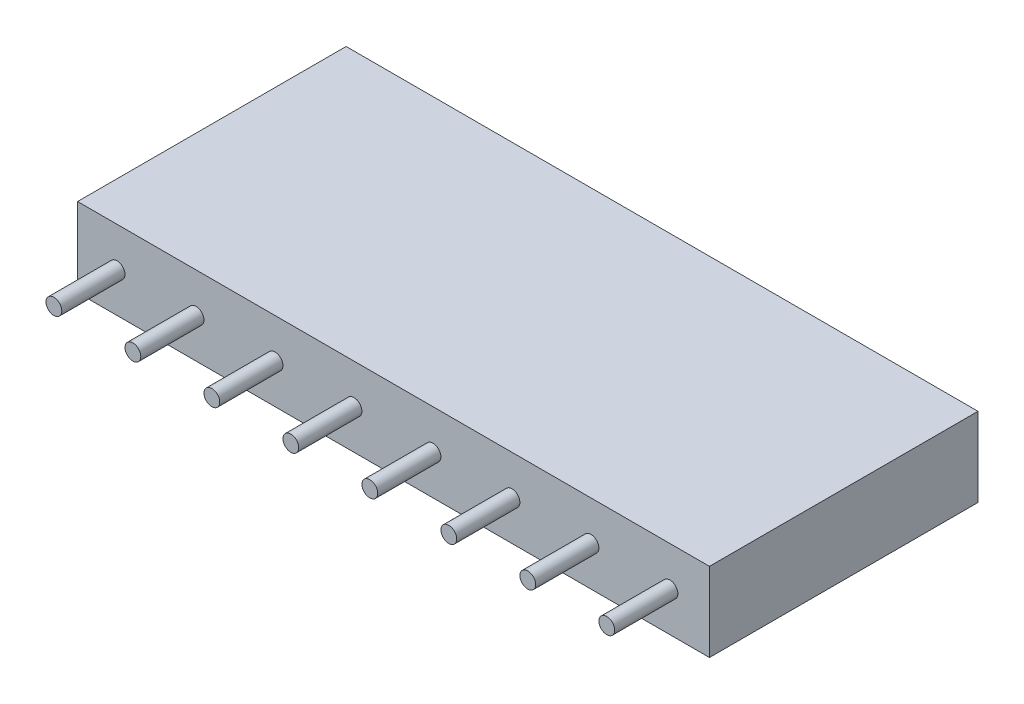
ISO-10303-21;
HEADER;
FILE_DESCRIPTION(('STEP AP214'),'2;1');
FILE_NAME('part.step','',(''),(''),'','','');
FILE_SCHEMA(('AUTOMOTIVE_DESIGN { 1 0 10303 214 1 1 1 1 }'));
ENDSEC;
DATA;
#1=APPLICATION_CONTEXT('core data for automotive mechanical design processes');
#2=APPLICATION_PROTOCOL_DEFINITION('international standard','automotive_design',2000,#1);
#3=PRODUCT_CONTEXT('',#1,'mechanical');
#4=PRODUCT('Part','Part','',(#3));
#5=PRODUCT_RELATED_PRODUCT_CATEGORY('part','',(#4));
#6=PRODUCT_DEFINITION_FORMATION('','',#4);
#7=PRODUCT_DEFINITION_CONTEXT('part definition',#1,'design');
#8=PRODUCT_DEFINITION('design','',#6,#7);
#9=PRODUCT_DEFINITION_SHAPE('','',#8);
#10=(LENGTH_UNIT() NAMED_UNIT(*) SI_UNIT(.MILLI.,.METRE.));
#11=(NAMED_UNIT(*) PLANE_ANGLE_UNIT() SI_UNIT($,.RADIAN.));
#12=(NAMED_UNIT(*) SI_UNIT($,.STERADIAN.) SOLID_ANGLE_UNIT());
#13=UNCERTAINTY_MEASURE_WITH_UNIT(LENGTH_MEASURE(1.E-05),#10,'distance_accuracy_value','');
#14=(GEOMETRIC_REPRESENTATION_CONTEXT(3) GLOBAL_UNCERTAINTY_ASSIGNED_CONTEXT((#13)) GLOBAL_UNIT_ASSIGNED_CONTEXT((#10,
#11,#12)) REPRESENTATION_CONTEXT('',''));
#15=CARTESIAN_POINT('',(0.,0.,0.));
#16=DIRECTION('',(0.,0.,1.));
#17=DIRECTION('',(1.,0.,0.));
#18=AXIS2_PLACEMENT_3D('',#15,#16,#17);
#19=CARTESIAN_POINT('',(-18.75,1.25,10.5));
#20=DIRECTION('',(0.,0.,1.));
#21=DIRECTION('',(1.,0.,0.));
#22=AXIS2_PLACEMENT_3D('',#19,#20,#21);
#23=PLANE('',#22);
#24=CARTESIAN_POINT('',(-18.75,1.25,10.5));
#25=DIRECTION('',(0.,0.,1.));
#26=DIRECTION('',(1.,0.,0.));
#27=AXIS2_PLACEMENT_3D('',#24,#25,#26);
#28=CIRCLE('',#27,0.25);
#29=CARTESIAN_POINT('',(-18.5,1.25,10.5));
#30=VERTEX_POINT('',#29);
#31=EDGE_CURVE('E11',#30,#30,#28,.T.);
#32=ORIENTED_EDGE('',*,*,#31,.T.);
#33=EDGE_LOOP('',(#32));
#34=FACE_BOUND('',#33,.T.);
#35=ADVANCED_FACE('F33',(#34),#23,.T.);
#36=CARTESIAN_POINT('',(-18.75,1.25,10.5));
#37=DIRECTION('',(0.,0.,-1.));
#38=DIRECTION('',(-1.,0.,0.));
#39=AXIS2_PLACEMENT_3D('',#36,#37,#38);
#40=CYLINDRICAL_SURFACE('',#39,0.25);
#41=ORIENTED_EDGE('',*,*,#31,.F.);
#42=EDGE_LOOP('',(#41));
#43=FACE_BOUND('',#42,.T.);
#44=CARTESIAN_POINT('',(-18.75,1.25,8.5));
#45=DIRECTION('',(0.,0.,1.));
#46=DIRECTION('',(1.,0.,0.));
#47=AXIS2_PLACEMENT_3D('',#44,#45,#46);
#48=CIRCLE('',#47,0.25);
#49=CARTESIAN_POINT('',(-18.5,1.25,8.5));
#50=VERTEX_POINT('',#49);
#51=EDGE_CURVE('E41',#50,#50,#48,.T.);
#52=ORIENTED_EDGE('',*,*,#51,.T.);
#53=EDGE_LOOP('',(#52));
#54=FACE_BOUND('',#53,.T.);
#55=ADVANCED_FACE('F153',(#43,#54),#40,.T.);
#56=CARTESIAN_POINT('',(-16.25,1.25,10.5));
#57=DIRECTION('',(0.,0.,1.));
#58=DIRECTION('',(1.,0.,0.));
#59=AXIS2_PLACEMENT_3D('',#56,#57,#58);
#60=PLANE('',#59);
#61=CARTESIAN_POINT('',(-16.25,1.25,10.5));
#62=DIRECTION('',(0.,0.,1.));
#63=DIRECTION('',(1.,0.,0.));
#64=AXIS2_PLACEMENT_3D('',#61,#62,#63);
#65=CIRCLE('',#64,0.25);
#66=CARTESIAN_POINT('',(-16.,1.25,10.5));
#67=VERTEX_POINT('',#66);
#68=EDGE_CURVE('E148',#67,#67,#65,.T.);
#69=ORIENTED_EDGE('',*,*,#68,.T.);
#70=EDGE_LOOP('',(#69));
#71=FACE_BOUND('',#70,.T.);
#72=ADVANCED_FACE('F176',(#71),#60,.T.);
#73=CARTESIAN_POINT('',(-16.25,1.25,10.5));
#74=DIRECTION('',(0.,0.,-1.));
#75=DIRECTION('',(-1.,0.,0.));
#76=AXIS2_PLACEMENT_3D('',#73,#74,#75);
#77=CYLINDRICAL_SURFACE('',#76,0.25);
#78=ORIENTED_EDGE('',*,*,#68,.F.);
#79=EDGE_LOOP('',(#78));
#80=FACE_BOUND('',#79,.T.);
#81=CARTESIAN_POINT('',(-16.25,1.25,8.5));
#82=DIRECTION('',(0.,0.,1.));
#83=DIRECTION('',(1.,0.,0.));
#84=AXIS2_PLACEMENT_3D('',#81,#82,#83);
#85=CIRCLE('',#84,0.25);
#86=CARTESIAN_POINT('',(-16.,1.25,8.5));
#87=VERTEX_POINT('',#86);
#88=EDGE_CURVE('E145',#87,#87,#85,.T.);
#89=ORIENTED_EDGE('',*,*,#88,.T.);
#90=EDGE_LOOP('',(#89));
#91=FACE_BOUND('',#90,.T.);
#92=ADVANCED_FACE('F182',(#80,#91),#77,.T.);
#93=CARTESIAN_POINT('',(-13.75,1.25,10.5));
#94=DIRECTION('',(0.,0.,1.));
#95=DIRECTION('',(1.,0.,0.));
#96=AXIS2_PLACEMENT_3D('',#93,#94,#95);
#97=PLANE('',#96);
#98=CARTESIAN_POINT('',(-13.75,1.25,10.5));
#99=DIRECTION('',(0.,0.,1.));
#100=DIRECTION('',(1.,0.,0.));
#101=AXIS2_PLACEMENT_3D('',#98,#99,#100);
#102=CIRCLE('',#101,0.25);
#103=CARTESIAN_POINT('',(-13.5,1.25,10.5));
#104=VERTEX_POINT('',#103);
#105=EDGE_CURVE('E142',#104,#104,#102,.T.);
#106=ORIENTED_EDGE('',*,*,#105,.T.);
#107=EDGE_LOOP('',(#106));
#108=FACE_BOUND('',#107,.T.);
#109=ADVANCED_FACE('F188',(#108),#97,.T.);
#110=CARTESIAN_POINT('',(-13.75,1.25,10.5));
#111=DIRECTION('',(0.,0.,-1.));
#112=DIRECTION('',(-1.,0.,0.));
#113=AXIS2_PLACEMENT_3D('',#110,#111,#112);
#114=CYLINDRICAL_SURFACE('',#113,0.25);
#115=ORIENTED_EDGE('',*,*,#105,.F.);
#116=EDGE_LOOP('',(#115));
#117=FACE_BOUND('',#116,.T.);
#118=CARTESIAN_POINT('',(-13.75,1.25,8.5));
#119=DIRECTION('',(0.,0.,1.));
#120=DIRECTION('',(1.,0.,0.));
#121=AXIS2_PLACEMENT_3D('',#118,#119,#120);
#122=CIRCLE('',#121,0.25);
#123=CARTESIAN_POINT('',(-13.5,1.25,8.5));
#124=VERTEX_POINT('',#123);
#125=EDGE_CURVE('E139',#124,#124,#122,.T.);
#126=ORIENTED_EDGE('',*,*,#125,.T.);
#127=EDGE_LOOP('',(#126));
#128=FACE_BOUND('',#127,.T.);
#129=ADVANCED_FACE('F192',(#117,#128),#114,.T.);
#130=CARTESIAN_POINT('',(-11.25,1.25,10.5));
#131=DIRECTION('',(0.,0.,1.));
#132=DIRECTION('',(1.,0.,0.));
#133=AXIS2_PLACEMENT_3D('',#130,#131,#132);
#134=PLANE('',#133);
#135=CARTESIAN_POINT('',(-11.25,1.25,10.5));
#136=DIRECTION('',(0.,0.,1.));
#137=DIRECTION('',(1.,0.,0.));
#138=AXIS2_PLACEMENT_3D('',#135,#136,#137);
#139=CIRCLE('',#138,0.25);
#140=CARTESIAN_POINT('',(-11.,1.25,10.5));
#141=VERTEX_POINT('',#140);
#142=EDGE_CURVE('E136',#141,#141,#139,.T.);
#143=ORIENTED_EDGE('',*,*,#142,.T.);
#144=EDGE_LOOP('',(#143));
#145=FACE_BOUND('',#144,.T.);
#146=ADVANCED_FACE('F196',(#145),#134,.T.);
#147=CARTESIAN_POINT('',(-11.25,1.25,10.5));
#148=DIRECTION('',(0.,0.,-1.));
#149=DIRECTION('',(-1.,0.,0.));
#150=AXIS2_PLACEMENT_3D('',#147,#148,#149);
#151=CYLINDRICAL_SURFACE('',#150,0.25);
#152=ORIENTED_EDGE('',*,*,#142,.F.);
#153=EDGE_LOOP('',(#152));
#154=FACE_BOUND('',#153,.T.);
#155=CARTESIAN_POINT('',(-11.25,1.25,8.5));
#156=DIRECTION('',(0.,0.,1.));
#157=DIRECTION('',(1.,0.,0.));
#158=AXIS2_PLACEMENT_3D('',#155,#156,#157);
#159=CIRCLE('',#158,0.25);
#160=CARTESIAN_POINT('',(-11.,1.25,8.5));
#161=VERTEX_POINT('',#160);
#162=EDGE_CURVE('E133',#161,#161,#159,.T.);
#163=ORIENTED_EDGE('',*,*,#162,.T.);
#164=EDGE_LOOP('',(#163));
#165=FACE_BOUND('',#164,.T.);
#166=ADVANCED_FACE('F200',(#154,#165),#151,.T.);
#167=CARTESIAN_POINT('',(-8.75,1.25,10.5));
#168=DIRECTION('',(0.,0.,1.));
#169=DIRECTION('',(1.,0.,0.));
#170=AXIS2_PLACEMENT_3D('',#167,#168,#169);
#171=PLANE('',#170);
#172=CARTESIAN_POINT('',(-8.75,1.25,10.5));
#173=DIRECTION('',(0.,0.,1.));
#174=DIRECTION('',(1.,0.,0.));
#175=AXIS2_PLACEMENT_3D('',#172,#173,#174);
#176=CIRCLE('',#175,0.25);
#177=CARTESIAN_POINT('',(-8.5,1.25,10.5));
#178=VERTEX_POINT('',#177);
#179=EDGE_CURVE('E130',#178,#178,#176,.T.);
#180=ORIENTED_EDGE('',*,*,#179,.T.);
#181=EDGE_LOOP('',(#180));
#182=FACE_BOUND('',#181,.T.);
#183=ADVANCED_FACE('F204',(#182),#171,.T.);
#184=CARTESIAN_POINT('',(-8.75,1.25,10.5));
#185=DIRECTION('',(0.,0.,-1.));
#186=DIRECTION('',(-1.,0.,0.));
#187=AXIS2_PLACEMENT_3D('',#184,#185,#186);
#188=CYLINDRICAL_SURFACE('',#187,0.25);
#189=ORIENTED_EDGE('',*,*,#179,.F.);
#190=EDGE_LOOP('',(#189));
#191=FACE_BOUND('',#190,.T.);
#192=CARTESIAN_POINT('',(-8.75,1.25,8.5));
#193=DIRECTION('',(0.,0.,1.));
#194=DIRECTION('',(1.,0.,0.));
#195=AXIS2_PLACEMENT_3D('',#192,#193,#194);
#196=CIRCLE('',#195,0.25);
#197=CARTESIAN_POINT('',(-8.5,1.25,8.5));
#198=VERTEX_POINT('',#197);
#199=EDGE_CURVE('E127',#198,#198,#196,.T.);
#200=ORIENTED_EDGE('',*,*,#199,.T.);
#201=EDGE_LOOP('',(#200));
#202=FACE_BOUND('',#201,.T.);
#203=ADVANCED_FACE('F208',(#191,#202),#188,.T.);
#204=CARTESIAN_POINT('',(-6.25,1.25,10.5));
#205=DIRECTION('',(0.,0.,1.));
#206=DIRECTION('',(1.,0.,0.));
#207=AXIS2_PLACEMENT_3D('',#204,#205,#206);
#208=PLANE('',#207);
#209=CARTESIAN_POINT('',(-6.25,1.25,10.5));
#210=DIRECTION('',(0.,0.,1.));
#211=DIRECTION('',(1.,0.,0.));
#212=AXIS2_PLACEMENT_3D('',#209,#210,#211);
#213=CIRCLE('',#212,0.25);
#214=CARTESIAN_POINT('',(-6.,1.25,10.5));
#215=VERTEX_POINT('',#214);
#216=EDGE_CURVE('E124',#215,#215,#213,.T.);
#217=ORIENTED_EDGE('',*,*,#216,.T.);
#218=EDGE_LOOP('',(#217));
#219=FACE_BOUND('',#218,.T.);
#220=ADVANCED_FACE('F212',(#219),#208,.T.);
#221=CARTESIAN_POINT('',(-6.25,1.25,10.5));
#222=DIRECTION('',(0.,0.,-1.));
#223=DIRECTION('',(-1.,0.,0.));
#224=AXIS2_PLACEMENT_3D('',#221,#222,#223);
#225=CYLINDRICAL_SURFACE('',#224,0.25);
#226=ORIENTED_EDGE('',*,*,#216,.F.);
#227=EDGE_LOOP('',(#226));
#228=FACE_BOUND('',#227,.T.);
#229=CARTESIAN_POINT('',(-6.25,1.25,8.5));
#230=DIRECTION('',(0.,0.,1.));
#231=DIRECTION('',(1.,0.,0.));
#232=AXIS2_PLACEMENT_3D('',#229,#230,#231);
#233=CIRCLE('',#232,0.25);
#234=CARTESIAN_POINT('',(-6.,1.25,8.5));
#235=VERTEX_POINT('',#234);
#236=EDGE_CURVE('E121',#235,#235,#233,.T.);
#237=ORIENTED_EDGE('',*,*,#236,.T.);
#238=EDGE_LOOP('',(#237));
#239=FACE_BOUND('',#238,.T.);
#240=ADVANCED_FACE('F216',(#228,#239),#225,.T.);
#241=CARTESIAN_POINT('',(0.,0.,8.5));
#242=DIRECTION('',(-1.,0.,0.));
#243=DIRECTION('',(0.,0.,1.));
#244=AXIS2_PLACEMENT_3D('',#241,#242,#243);
#245=PLANE('',#244);
#246=DIRECTION('',(0.,1.,0.));
#247=VECTOR('',#246,1.);
#248=CARTESIAN_POINT('',(0.,0.,0.));
#249=LINE('',#248,#247);
#250=CARTESIAN_POINT('',(0.,0.,0.));
#251=VERTEX_POINT('',#250);
#252=CARTESIAN_POINT('',(0.,2.5,0.));
#253=VERTEX_POINT('',#252);
#254=EDGE_CURVE('E79',#251,#253,#249,.T.);
#255=ORIENTED_EDGE('',*,*,#254,.T.);
#256=DIRECTION('',(0.,0.,-1.));
#257=VECTOR('',#256,1.);
#258=CARTESIAN_POINT('',(0.,2.5,8.5));
#259=LINE('',#258,#257);
#260=CARTESIAN_POINT('',(0.,2.5,8.5));
#261=VERTEX_POINT('',#260);
#262=EDGE_CURVE('E119',#261,#253,#259,.T.);
#263=ORIENTED_EDGE('',*,*,#262,.F.);
#264=DIRECTION('',(0.,1.,0.));
#265=VECTOR('',#264,1.);
#266=CARTESIAN_POINT('',(0.,0.,8.5));
#267=LINE('',#266,#265);
#268=CARTESIAN_POINT('',(0.,0.,8.5));
#269=VERTEX_POINT('',#268);
#270=EDGE_CURVE('E81',#269,#261,#267,.T.);
#271=ORIENTED_EDGE('',*,*,#270,.F.);
#272=DIRECTION('',(0.,0.,-1.));
#273=VECTOR('',#272,1.);
#274=CARTESIAN_POINT('',(0.,0.,8.5));
#275=LINE('',#274,#273);
#276=EDGE_CURVE('E115',#269,#251,#275,.T.);
#277=ORIENTED_EDGE('',*,*,#276,.T.);
#278=EDGE_LOOP('',(#255,#263,#271,#277));
#279=FACE_BOUND('',#278,.T.);
#280=ADVANCED_FACE('F220',(#279),#245,.F.);
#281=CARTESIAN_POINT('',(0.,2.5,8.5));
#282=DIRECTION('',(0.,-1.,0.));
#283=DIRECTION('',(1.,0.,0.));
#284=AXIS2_PLACEMENT_3D('',#281,#282,#283);
#285=PLANE('',#284);
#286=DIRECTION('',(-1.,0.,0.));
#287=VECTOR('',#286,1.);
#288=CARTESIAN_POINT('',(0.,2.5,0.));
#289=LINE('',#288,#287);
#290=CARTESIAN_POINT('',(-20.,2.5,0.));
#291=VERTEX_POINT('',#290);
#292=EDGE_CURVE('E61',#253,#291,#289,.T.);
#293=ORIENTED_EDGE('',*,*,#292,.T.);
#294=DIRECTION('',(0.,0.,-1.));
#295=VECTOR('',#294,1.);
#296=CARTESIAN_POINT('',(-20.,2.5,8.5));
#297=LINE('',#296,#295);
#298=CARTESIAN_POINT('',(-20.,2.5,8.5));
#299=VERTEX_POINT('',#298);
#300=EDGE_CURVE('E90',#299,#291,#297,.T.);
#301=ORIENTED_EDGE('',*,*,#300,.F.);
#302=DIRECTION('',(-1.,0.,0.));
#303=VECTOR('',#302,1.);
#304=CARTESIAN_POINT('',(0.,2.5,8.5));
#305=LINE('',#304,#303);
#306=EDGE_CURVE('E112',#261,#299,#305,.T.);
#307=ORIENTED_EDGE('',*,*,#306,.F.);
#308=ORIENTED_EDGE('',*,*,#262,.T.);
#309=EDGE_LOOP('',(#293,#301,#307,#308));
#310=FACE_BOUND('',#309,.T.);
#311=ADVANCED_FACE('F166',(#310),#285,.F.);
#312=CARTESIAN_POINT('',(0.,0.,8.5));
#313=DIRECTION('',(0.,1.,0.));
#314=DIRECTION('',(0.,0.,1.));
#315=AXIS2_PLACEMENT_3D('',#312,#313,#314);
#316=PLANE('',#315);
#317=DIRECTION('',(1.,0.,0.));
#318=VECTOR('',#317,1.);
#319=CARTESIAN_POINT('',(0.,0.,0.));
#320=LINE('',#319,#318);
#321=CARTESIAN_POINT('',(-20.,0.,0.));
#322=VERTEX_POINT('',#321);
#323=EDGE_CURVE('E74',#322,#251,#320,.T.);
#324=ORIENTED_EDGE('',*,*,#323,.T.);
#325=ORIENTED_EDGE('',*,*,#276,.F.);
#326=DIRECTION('',(1.,0.,0.));
#327=VECTOR('',#326,1.);
#328=CARTESIAN_POINT('',(0.,0.,8.5));
#329=LINE('',#328,#327);
#330=CARTESIAN_POINT('',(-20.,0.,8.5));
#331=VERTEX_POINT('',#330);
#332=EDGE_CURVE('E49',#331,#269,#329,.T.);
#333=ORIENTED_EDGE('',*,*,#332,.F.);
#334=DIRECTION('',(0.,0.,-1.));
#335=VECTOR('',#334,1.);
#336=CARTESIAN_POINT('',(-20.,0.,8.5));
#337=LINE('',#336,#335);
#338=EDGE_CURVE('E88',#331,#322,#337,.T.);
#339=ORIENTED_EDGE('',*,*,#338,.T.);
#340=EDGE_LOOP('',(#324,#325,#333,#339));
#341=FACE_BOUND('',#340,.T.);
#342=ADVANCED_FACE('F94',(#341),#316,.F.);
#343=CARTESIAN_POINT('',(0.,0.,8.5));
#344=DIRECTION('',(0.,0.,1.));
#345=DIRECTION('',(1.,0.,0.));
#346=AXIS2_PLACEMENT_3D('',#343,#344,#345);
#347=PLANE('',#346);
#348=CARTESIAN_POINT('',(-3.75,1.25,8.5));
#349=DIRECTION('',(0.,0.,1.));
#350=DIRECTION('',(1.,0.,0.));
#351=AXIS2_PLACEMENT_3D('',#348,#349,#350);
#352=CIRCLE('',#351,0.25);
#353=CARTESIAN_POINT('',(-3.5,1.25,8.5));
#354=VERTEX_POINT('',#353);
#355=EDGE_CURVE('E568',#354,#354,#352,.T.);
#356=ORIENTED_EDGE('',*,*,#355,.F.);
#357=EDGE_LOOP('',(#356));
#358=FACE_BOUND('',#357,.T.);
#359=CARTESIAN_POINT('',(-1.25,1.25,8.5));
#360=DIRECTION('',(0.,0.,1.));
#361=DIRECTION('',(1.,0.,0.));
#362=AXIS2_PLACEMENT_3D('',#359,#360,#361);
#363=CIRCLE('',#362,0.25);
#364=CARTESIAN_POINT('',(-1.,1.25,8.5));
#365=VERTEX_POINT('',#364);
#366=EDGE_CURVE('E103',#365,#365,#363,.T.);
#367=ORIENTED_EDGE('',*,*,#366,.F.);
#368=EDGE_LOOP('',(#367));
#369=FACE_BOUND('',#368,.T.);
#370=ORIENTED_EDGE('',*,*,#270,.T.);
#371=ORIENTED_EDGE('',*,*,#306,.T.);
#372=DIRECTION('',(0.,-1.,0.));
#373=VECTOR('',#372,1.);
#374=CARTESIAN_POINT('',(-20.,0.,8.5));
#375=LINE('',#374,#373);
#376=EDGE_CURVE('E91',#299,#331,#375,.T.);
#377=ORIENTED_EDGE('',*,*,#376,.T.);
#378=ORIENTED_EDGE('',*,*,#332,.T.);
#379=EDGE_LOOP('',(#370,#371,#377,#378));
#380=FACE_BOUND('',#379,.T.);
#381=ORIENTED_EDGE('',*,*,#236,.F.);
#382=EDGE_LOOP('',(#381));
#383=FACE_BOUND('',#382,.T.);
#384=ORIENTED_EDGE('',*,*,#199,.F.);
#385=EDGE_LOOP('',(#384));
#386=FACE_BOUND('',#385,.T.);
#387=ORIENTED_EDGE('',*,*,#162,.F.);
#388=EDGE_LOOP('',(#387));
#389=FACE_BOUND('',#388,.T.);
#390=ORIENTED_EDGE('',*,*,#125,.F.);
#391=EDGE_LOOP('',(#390));
#392=FACE_BOUND('',#391,.T.);
#393=ORIENTED_EDGE('',*,*,#88,.F.);
#394=EDGE_LOOP('',(#393));
#395=FACE_BOUND('',#394,.T.);
#396=ORIENTED_EDGE('',*,*,#51,.F.);
#397=EDGE_LOOP('',(#396));
#398=FACE_BOUND('',#397,.T.);
#399=ADVANCED_FACE('F155',(#358,#369,#380,#383,#386,#389,#392,#395,#398),#347,.T.);
#400=CARTESIAN_POINT('',(0.,0.,0.));
#401=DIRECTION('',(0.,0.,1.));
#402=DIRECTION('',(1.,0.,0.));
#403=AXIS2_PLACEMENT_3D('',#400,#401,#402);
#404=PLANE('',#403);
#405=CARTESIAN_POINT('',(-3.75,1.25,0.));
#406=DIRECTION('',(0.,0.,-1.));
#407=DIRECTION('',(-1.,0.,0.));
#408=AXIS2_PLACEMENT_3D('',#405,#406,#407);
#409=CIRCLE('',#408,0.25);
#410=CARTESIAN_POINT('',(-4.,1.25,0.));
#411=VERTEX_POINT('',#410);
#412=EDGE_CURVE('E569',#411,#411,#409,.T.);
#413=ORIENTED_EDGE('',*,*,#412,.F.);
#414=EDGE_LOOP('',(#413));
#415=FACE_BOUND('',#414,.T.);
#416=CARTESIAN_POINT('',(-6.25,1.25,0.));
#417=DIRECTION('',(0.,0.,-1.));
#418=DIRECTION('',(-1.,0.,0.));
#419=AXIS2_PLACEMENT_3D('',#416,#417,#418);
#420=CIRCLE('',#419,0.25);
#421=CARTESIAN_POINT('',(-6.5,1.25,0.));
#422=VERTEX_POINT('',#421);
#423=EDGE_CURVE('E579',#422,#422,#420,.T.);
#424=ORIENTED_EDGE('',*,*,#423,.F.);
#425=EDGE_LOOP('',(#424));
#426=FACE_BOUND('',#425,.T.);
#427=CARTESIAN_POINT('',(-8.75,1.25,0.));
#428=DIRECTION('',(0.,0.,-1.));
#429=DIRECTION('',(-1.,0.,0.));
#430=AXIS2_PLACEMENT_3D('',#427,#428,#429);
#431=CIRCLE('',#430,0.25);
#432=CARTESIAN_POINT('',(-9.,1.25,0.));
#433=VERTEX_POINT('',#432);
#434=EDGE_CURVE('E585',#433,#433,#431,.T.);
#435=ORIENTED_EDGE('',*,*,#434,.F.);
#436=EDGE_LOOP('',(#435));
#437=FACE_BOUND('',#436,.T.);
#438=CARTESIAN_POINT('',(-11.25,1.25,0.));
#439=DIRECTION('',(0.,0.,-1.));
#440=DIRECTION('',(-1.,0.,0.));
#441=AXIS2_PLACEMENT_3D('',#438,#439,#440);
#442=CIRCLE('',#441,0.25);
#443=CARTESIAN_POINT('',(-11.5,1.25,0.));
#444=VERTEX_POINT('',#443);
#445=EDGE_CURVE('E591',#444,#444,#442,.T.);
#446=ORIENTED_EDGE('',*,*,#445,.F.);
#447=EDGE_LOOP('',(#446));
#448=FACE_BOUND('',#447,.T.);
#449=CARTESIAN_POINT('',(-13.75,1.25,0.));
#450=DIRECTION('',(0.,0.,-1.));
#451=DIRECTION('',(-1.,0.,0.));
#452=AXIS2_PLACEMENT_3D('',#449,#450,#451);
#453=CIRCLE('',#452,0.25);
#454=CARTESIAN_POINT('',(-14.,1.25,0.));
#455=VERTEX_POINT('',#454);
#456=EDGE_CURVE('E597',#455,#455,#453,.T.);
#457=ORIENTED_EDGE('',*,*,#456,.F.);
#458=EDGE_LOOP('',(#457));
#459=FACE_BOUND('',#458,.T.);
#460=CARTESIAN_POINT('',(-16.25,1.25,0.));
#461=DIRECTION('',(0.,0.,-1.));
#462=DIRECTION('',(-1.,0.,0.));
#463=AXIS2_PLACEMENT_3D('',#460,#461,#462);
#464=CIRCLE('',#463,0.25);
#465=CARTESIAN_POINT('',(-16.5,1.25,0.));
#466=VERTEX_POINT('',#465);
#467=EDGE_CURVE('E603',#466,#466,#464,.T.);
#468=ORIENTED_EDGE('',*,*,#467,.F.);
#469=EDGE_LOOP('',(#468));
#470=FACE_BOUND('',#469,.T.);
#471=CARTESIAN_POINT('',(-18.75,1.25,0.));
#472=DIRECTION('',(0.,0.,-1.));
#473=DIRECTION('',(-1.,0.,0.));
#474=AXIS2_PLACEMENT_3D('',#471,#472,#473);
#475=CIRCLE('',#474,0.25);
#476=CARTESIAN_POINT('',(-19.,1.25,0.));
#477=VERTEX_POINT('',#476);
#478=EDGE_CURVE('E609',#477,#477,#475,.T.);
#479=ORIENTED_EDGE('',*,*,#478,.F.);
#480=EDGE_LOOP('',(#479));
#481=FACE_BOUND('',#480,.T.);
#482=CARTESIAN_POINT('',(-1.25,1.25,0.));
#483=DIRECTION('',(0.,0.,-1.));
#484=DIRECTION('',(-1.,0.,0.));
#485=AXIS2_PLACEMENT_3D('',#482,#483,#484);
#486=CIRCLE('',#485,0.25);
#487=CARTESIAN_POINT('',(-1.5,1.25,0.));
#488=VERTEX_POINT('',#487);
#489=EDGE_CURVE('E96',#488,#488,#486,.T.);
#490=ORIENTED_EDGE('',*,*,#489,.F.);
#491=EDGE_LOOP('',(#490));
#492=FACE_BOUND('',#491,.T.);
#493=ORIENTED_EDGE('',*,*,#254,.F.);
#494=ORIENTED_EDGE('',*,*,#323,.F.);
#495=DIRECTION('',(0.,-1.,0.));
#496=VECTOR('',#495,1.);
#497=CARTESIAN_POINT('',(-20.,0.,0.));
#498=LINE('',#497,#496);
#499=EDGE_CURVE('E77',#291,#322,#498,.T.);
#500=ORIENTED_EDGE('',*,*,#499,.F.);
#501=ORIENTED_EDGE('',*,*,#292,.F.);
#502=EDGE_LOOP('',(#493,#494,#500,#501));
#503=FACE_BOUND('',#502,.T.);
#504=ADVANCED_FACE('F76',(#415,#426,#437,#448,#459,#470,#481,#492,#503),#404,.F.);
#505=CARTESIAN_POINT('',(-1.25,1.25,10.5));
#506=DIRECTION('',(0.,0.,-1.));
#507=DIRECTION('',(-1.,0.,0.));
#508=AXIS2_PLACEMENT_3D('',#505,#506,#507);
#509=CYLINDRICAL_SURFACE('',#508,0.25);
#510=CARTESIAN_POINT('',(-1.25,1.25,10.5));
#511=DIRECTION('',(0.,0.,1.));
#512=DIRECTION('',(1.,0.,0.));
#513=AXIS2_PLACEMENT_3D('',#510,#511,#512);
#514=CIRCLE('',#513,0.25);
#515=CARTESIAN_POINT('',(-1.,1.25,10.5));
#516=VERTEX_POINT('',#515);
#517=EDGE_CURVE('E106',#516,#516,#514,.T.);
#518=ORIENTED_EDGE('',*,*,#517,.F.);
#519=EDGE_LOOP('',(#518));
#520=FACE_BOUND('',#519,.T.);
#521=ORIENTED_EDGE('',*,*,#366,.T.);
#522=EDGE_LOOP('',(#521));
#523=FACE_BOUND('',#522,.T.);
#524=ADVANCED_FACE('F163',(#520,#523),#509,.T.);
#525=CARTESIAN_POINT('',(-1.25,1.25,10.5));
#526=DIRECTION('',(0.,0.,1.));
#527=DIRECTION('',(1.,0.,0.));
#528=AXIS2_PLACEMENT_3D('',#525,#526,#527);
#529=PLANE('',#528);
#530=ORIENTED_EDGE('',*,*,#517,.T.);
#531=EDGE_LOOP('',(#530));
#532=FACE_BOUND('',#531,.T.);
#533=ADVANCED_FACE('F450',(#532),#529,.T.);
#534=CARTESIAN_POINT('',(-1.25,1.25,4.));
#535=DIRECTION('',(0.,0.,-1.));
#536=DIRECTION('',(-1.,0.,0.));
#537=AXIS2_PLACEMENT_3D('',#534,#535,#536);
#538=CYLINDRICAL_SURFACE('',#537,0.25);
#539=CARTESIAN_POINT('',(-1.25,1.25,4.));
#540=DIRECTION('',(0.,0.,-1.));
#541=DIRECTION('',(-1.,0.,0.));
#542=AXIS2_PLACEMENT_3D('',#539,#540,#541);
#543=CIRCLE('',#542,0.25);
#544=CARTESIAN_POINT('',(-1.5,1.25,4.));
#545=VERTEX_POINT('',#544);
#546=EDGE_CURVE('E100',#545,#545,#543,.T.);
#547=ORIENTED_EDGE('',*,*,#546,.F.);
#548=EDGE_LOOP('',(#547));
#549=FACE_BOUND('',#548,.T.);
#550=ORIENTED_EDGE('',*,*,#489,.T.);
#551=EDGE_LOOP('',(#550));
#552=FACE_BOUND('',#551,.T.);
#553=ADVANCED_FACE('F446',(#549,#552),#538,.F.);
#554=CARTESIAN_POINT('',(-1.25,1.25,4.));
#555=DIRECTION('',(0.,0.,-1.));
#556=DIRECTION('',(-1.,0.,0.));
#557=AXIS2_PLACEMENT_3D('',#554,#555,#556);
#558=PLANE('',#557);
#559=ORIENTED_EDGE('',*,*,#546,.T.);
#560=EDGE_LOOP('',(#559));
#561=FACE_BOUND('',#560,.T.);
#562=ADVANCED_FACE('F277',(#561),#558,.T.);
#563=CARTESIAN_POINT('',(-20.,0.,8.5));
#564=DIRECTION('',(1.,0.,0.));
#565=DIRECTION('',(0.,0.,-1.));
#566=AXIS2_PLACEMENT_3D('',#563,#564,#565);
#567=PLANE('',#566);
#568=ORIENTED_EDGE('',*,*,#499,.T.);
#569=ORIENTED_EDGE('',*,*,#338,.F.);
#570=ORIENTED_EDGE('',*,*,#376,.F.);
#571=ORIENTED_EDGE('',*,*,#300,.T.);
#572=EDGE_LOOP('',(#568,#569,#570,#571));
#573=FACE_BOUND('',#572,.T.);
#574=ADVANCED_FACE('F86',(#573),#567,.F.);
#575=CARTESIAN_POINT('',(-3.75,1.25,10.5));
#576=DIRECTION('',(0.,0.,-1.));
#577=DIRECTION('',(-1.,0.,0.));
#578=AXIS2_PLACEMENT_3D('',#575,#576,#577);
#579=CYLINDRICAL_SURFACE('',#578,0.25);
#580=CARTESIAN_POINT('',(-3.75,1.25,10.5));
#581=DIRECTION('',(0.,0.,1.));
#582=DIRECTION('',(1.,0.,0.));
#583=AXIS2_PLACEMENT_3D('',#580,#581,#582);
#584=CIRCLE('',#583,0.25);
#585=CARTESIAN_POINT('',(-3.5,1.25,10.5));
#586=VERTEX_POINT('',#585);
#587=EDGE_CURVE('E92',#586,#586,#584,.T.);
#588=ORIENTED_EDGE('',*,*,#587,.F.);
#589=EDGE_LOOP('',(#588));
#590=FACE_BOUND('',#589,.T.);
#591=ORIENTED_EDGE('',*,*,#355,.T.);
#592=EDGE_LOOP('',(#591));
#593=FACE_BOUND('',#592,.T.);
#594=ADVANCED_FACE('F276',(#590,#593),#579,.T.);
#595=CARTESIAN_POINT('',(-3.75,1.25,10.5));
#596=DIRECTION('',(0.,0.,1.));
#597=DIRECTION('',(1.,0.,0.));
#598=AXIS2_PLACEMENT_3D('',#595,#596,#597);
#599=PLANE('',#598);
#600=ORIENTED_EDGE('',*,*,#587,.T.);
#601=EDGE_LOOP('',(#600));
#602=FACE_BOUND('',#601,.T.);
#603=ADVANCED_FACE('F288',(#602),#599,.T.);
#604=CARTESIAN_POINT('',(-18.75,1.25,4.));
#605=DIRECTION('',(0.,0.,-1.));
#606=DIRECTION('',(-1.,0.,0.));
#607=AXIS2_PLACEMENT_3D('',#604,#605,#606);
#608=CYLINDRICAL_SURFACE('',#607,0.25);
#609=CARTESIAN_POINT('',(-18.75,1.25,4.));
#610=DIRECTION('',(0.,0.,-1.));
#611=DIRECTION('',(-1.,0.,0.));
#612=AXIS2_PLACEMENT_3D('',#609,#610,#611);
#613=CIRCLE('',#612,0.25);
#614=CARTESIAN_POINT('',(-19.,1.25,4.));
#615=VERTEX_POINT('',#614);
#616=EDGE_CURVE('E606',#615,#615,#613,.T.);
#617=ORIENTED_EDGE('',*,*,#616,.F.);
#618=EDGE_LOOP('',(#617));
#619=FACE_BOUND('',#618,.T.);
#620=ORIENTED_EDGE('',*,*,#478,.T.);
#621=EDGE_LOOP('',(#620));
#622=FACE_BOUND('',#621,.T.);
#623=ADVANCED_FACE('F299',(#619,#622),#608,.F.);
#624=CARTESIAN_POINT('',(-18.75,1.25,4.));
#625=DIRECTION('',(0.,0.,-1.));
#626=DIRECTION('',(-1.,0.,0.));
#627=AXIS2_PLACEMENT_3D('',#624,#625,#626);
#628=PLANE('',#627);
#629=ORIENTED_EDGE('',*,*,#616,.T.);
#630=EDGE_LOOP('',(#629));
#631=FACE_BOUND('',#630,.T.);
#632=ADVANCED_FACE('F309',(#631),#628,.T.);
#633=CARTESIAN_POINT('',(-16.25,1.25,4.));
#634=DIRECTION('',(0.,0.,-1.));
#635=DIRECTION('',(-1.,0.,0.));
#636=AXIS2_PLACEMENT_3D('',#633,#634,#635);
#637=CYLINDRICAL_SURFACE('',#636,0.25);
#638=CARTESIAN_POINT('',(-16.25,1.25,4.));
#639=DIRECTION('',(0.,0.,-1.));
#640=DIRECTION('',(-1.,0.,0.));
#641=AXIS2_PLACEMENT_3D('',#638,#639,#640);
#642=CIRCLE('',#641,0.25);
#643=CARTESIAN_POINT('',(-16.5,1.25,4.));
#644=VERTEX_POINT('',#643);
#645=EDGE_CURVE('E600',#644,#644,#642,.T.);
#646=ORIENTED_EDGE('',*,*,#645,.F.);
#647=EDGE_LOOP('',(#646));
#648=FACE_BOUND('',#647,.T.);
#649=ORIENTED_EDGE('',*,*,#467,.T.);
#650=EDGE_LOOP('',(#649));
#651=FACE_BOUND('',#650,.T.);
#652=ADVANCED_FACE('F319',(#648,#651),#637,.F.);
#653=CARTESIAN_POINT('',(-16.25,1.25,4.));
#654=DIRECTION('',(0.,0.,-1.));
#655=DIRECTION('',(-1.,0.,0.));
#656=AXIS2_PLACEMENT_3D('',#653,#654,#655);
#657=PLANE('',#656);
#658=ORIENTED_EDGE('',*,*,#645,.T.);
#659=EDGE_LOOP('',(#658));
#660=FACE_BOUND('',#659,.T.);
#661=ADVANCED_FACE('F329',(#660),#657,.T.);
#662=CARTESIAN_POINT('',(-13.75,1.25,4.));
#663=DIRECTION('',(0.,0.,-1.));
#664=DIRECTION('',(-1.,0.,0.));
#665=AXIS2_PLACEMENT_3D('',#662,#663,#664);
#666=CYLINDRICAL_SURFACE('',#665,0.25);
#667=CARTESIAN_POINT('',(-13.75,1.25,4.));
#668=DIRECTION('',(0.,0.,-1.));
#669=DIRECTION('',(-1.,0.,0.));
#670=AXIS2_PLACEMENT_3D('',#667,#668,#669);
#671=CIRCLE('',#670,0.25);
#672=CARTESIAN_POINT('',(-14.,1.25,4.));
#673=VERTEX_POINT('',#672);
#674=EDGE_CURVE('E594',#673,#673,#671,.T.);
#675=ORIENTED_EDGE('',*,*,#674,.F.);
#676=EDGE_LOOP('',(#675));
#677=FACE_BOUND('',#676,.T.);
#678=ORIENTED_EDGE('',*,*,#456,.T.);
#679=EDGE_LOOP('',(#678));
#680=FACE_BOUND('',#679,.T.);
#681=ADVANCED_FACE('F339',(#677,#680),#666,.F.);
#682=CARTESIAN_POINT('',(-13.75,1.25,4.));
#683=DIRECTION('',(0.,0.,-1.));
#684=DIRECTION('',(-1.,0.,0.));
#685=AXIS2_PLACEMENT_3D('',#682,#683,#684);
#686=PLANE('',#685);
#687=ORIENTED_EDGE('',*,*,#674,.T.);
#688=EDGE_LOOP('',(#687));
#689=FACE_BOUND('',#688,.T.);
#690=ADVANCED_FACE('F349',(#689),#686,.T.);
#691=CARTESIAN_POINT('',(-11.25,1.25,4.));
#692=DIRECTION('',(0.,0.,-1.));
#693=DIRECTION('',(-1.,0.,0.));
#694=AXIS2_PLACEMENT_3D('',#691,#692,#693);
#695=CYLINDRICAL_SURFACE('',#694,0.25);
#696=CARTESIAN_POINT('',(-11.25,1.25,4.));
#697=DIRECTION('',(0.,0.,-1.));
#698=DIRECTION('',(-1.,0.,0.));
#699=AXIS2_PLACEMENT_3D('',#696,#697,#698);
#700=CIRCLE('',#699,0.25);
#701=CARTESIAN_POINT('',(-11.5,1.25,4.));
#702=VERTEX_POINT('',#701);
#703=EDGE_CURVE('E588',#702,#702,#700,.T.);
#704=ORIENTED_EDGE('',*,*,#703,.F.);
#705=EDGE_LOOP('',(#704));
#706=FACE_BOUND('',#705,.T.);
#707=ORIENTED_EDGE('',*,*,#445,.T.);
#708=EDGE_LOOP('',(#707));
#709=FACE_BOUND('',#708,.T.);
#710=ADVANCED_FACE('F359',(#706,#709),#695,.F.);
#711=CARTESIAN_POINT('',(-11.25,1.25,4.));
#712=DIRECTION('',(0.,0.,-1.));
#713=DIRECTION('',(-1.,0.,0.));
#714=AXIS2_PLACEMENT_3D('',#711,#712,#713);
#715=PLANE('',#714);
#716=ORIENTED_EDGE('',*,*,#703,.T.);
#717=EDGE_LOOP('',(#716));
#718=FACE_BOUND('',#717,.T.);
#719=ADVANCED_FACE('F369',(#718),#715,.T.);
#720=CARTESIAN_POINT('',(-8.75,1.25,4.));
#721=DIRECTION('',(0.,0.,-1.));
#722=DIRECTION('',(-1.,0.,0.));
#723=AXIS2_PLACEMENT_3D('',#720,#721,#722);
#724=CYLINDRICAL_SURFACE('',#723,0.25);
#725=CARTESIAN_POINT('',(-8.75,1.25,4.));
#726=DIRECTION('',(0.,0.,-1.));
#727=DIRECTION('',(-1.,0.,0.));
#728=AXIS2_PLACEMENT_3D('',#725,#726,#727);
#729=CIRCLE('',#728,0.25);
#730=CARTESIAN_POINT('',(-9.,1.25,4.));
#731=VERTEX_POINT('',#730);
#732=EDGE_CURVE('E582',#731,#731,#729,.T.);
#733=ORIENTED_EDGE('',*,*,#732,.F.);
#734=EDGE_LOOP('',(#733));
#735=FACE_BOUND('',#734,.T.);
#736=ORIENTED_EDGE('',*,*,#434,.T.);
#737=EDGE_LOOP('',(#736));
#738=FACE_BOUND('',#737,.T.);
#739=ADVANCED_FACE('F379',(#735,#738),#724,.F.);
#740=CARTESIAN_POINT('',(-8.75,1.25,4.));
#741=DIRECTION('',(0.,0.,-1.));
#742=DIRECTION('',(-1.,0.,0.));
#743=AXIS2_PLACEMENT_3D('',#740,#741,#742);
#744=PLANE('',#743);
#745=ORIENTED_EDGE('',*,*,#732,.T.);
#746=EDGE_LOOP('',(#745));
#747=FACE_BOUND('',#746,.T.);
#748=ADVANCED_FACE('F389',(#747),#744,.T.);
#749=CARTESIAN_POINT('',(-6.25,1.25,4.));
#750=DIRECTION('',(0.,0.,-1.));
#751=DIRECTION('',(-1.,0.,0.));
#752=AXIS2_PLACEMENT_3D('',#749,#750,#751);
#753=CYLINDRICAL_SURFACE('',#752,0.25);
#754=CARTESIAN_POINT('',(-6.25,1.25,4.));
#755=DIRECTION('',(0.,0.,-1.));
#756=DIRECTION('',(-1.,0.,0.));
#757=AXIS2_PLACEMENT_3D('',#754,#755,#756);
#758=CIRCLE('',#757,0.25);
#759=CARTESIAN_POINT('',(-6.5,1.25,4.));
#760=VERTEX_POINT('',#759);
#761=EDGE_CURVE('E574',#760,#760,#758,.T.);
#762=ORIENTED_EDGE('',*,*,#761,.F.);
#763=EDGE_LOOP('',(#762));
#764=FACE_BOUND('',#763,.T.);
#765=ORIENTED_EDGE('',*,*,#423,.T.);
#766=EDGE_LOOP('',(#765));
#767=FACE_BOUND('',#766,.T.);
#768=ADVANCED_FACE('F399',(#764,#767),#753,.F.);
#769=CARTESIAN_POINT('',(-6.25,1.25,4.));
#770=DIRECTION('',(0.,0.,-1.));
#771=DIRECTION('',(-1.,0.,0.));
#772=AXIS2_PLACEMENT_3D('',#769,#770,#771);
#773=PLANE('',#772);
#774=ORIENTED_EDGE('',*,*,#761,.T.);
#775=EDGE_LOOP('',(#774));
#776=FACE_BOUND('',#775,.T.);
#777=ADVANCED_FACE('F409',(#776),#773,.T.);
#778=CARTESIAN_POINT('',(-3.75,1.25,4.));
#779=DIRECTION('',(0.,0.,-1.));
#780=DIRECTION('',(-1.,0.,0.));
#781=AXIS2_PLACEMENT_3D('',#778,#779,#780);
#782=CYLINDRICAL_SURFACE('',#781,0.25);
#783=CARTESIAN_POINT('',(-3.75,1.25,4.));
#784=DIRECTION('',(0.,0.,-1.));
#785=DIRECTION('',(-1.,0.,0.));
#786=AXIS2_PLACEMENT_3D('',#783,#784,#785);
#787=CIRCLE('',#786,0.25);
#788=CARTESIAN_POINT('',(-4.,1.25,4.));
#789=VERTEX_POINT('',#788);
#790=EDGE_CURVE('E567',#789,#789,#787,.T.);
#791=ORIENTED_EDGE('',*,*,#790,.F.);
#792=EDGE_LOOP('',(#791));
#793=FACE_BOUND('',#792,.T.);
#794=ORIENTED_EDGE('',*,*,#412,.T.);
#795=EDGE_LOOP('',(#794));
#796=FACE_BOUND('',#795,.T.);
#797=ADVANCED_FACE('F419',(#793,#796),#782,.F.);
#798=CARTESIAN_POINT('',(-3.75,1.25,4.));
#799=DIRECTION('',(0.,0.,-1.));
#800=DIRECTION('',(-1.,0.,0.));
#801=AXIS2_PLACEMENT_3D('',#798,#799,#800);
#802=PLANE('',#801);
#803=ORIENTED_EDGE('',*,*,#790,.T.);
#804=EDGE_LOOP('',(#803));
#805=FACE_BOUND('',#804,.T.);
#806=ADVANCED_FACE('F429',(#805),#802,.T.);
#807=CLOSED_SHELL('',(#35,#55,#72,#92,#109,#129,#146,#166,#183,#203,#220,#240,#280,#311,#342,
#399,#504,#524,#533,#553,#562,#574,#594,#603,#623,#632,#652,#661,#681,#690,#710,#719,#739,#748,
#768,#777,#797,#806));
#808=MANIFOLD_SOLID_BREP('B2',#807);
#809=ADVANCED_BREP_SHAPE_REPRESENTATION('',(#18,#808),#14);
#810=SHAPE_DEFINITION_REPRESENTATION(#9,#809);
ENDSEC;
END-ISO-10303-21;
